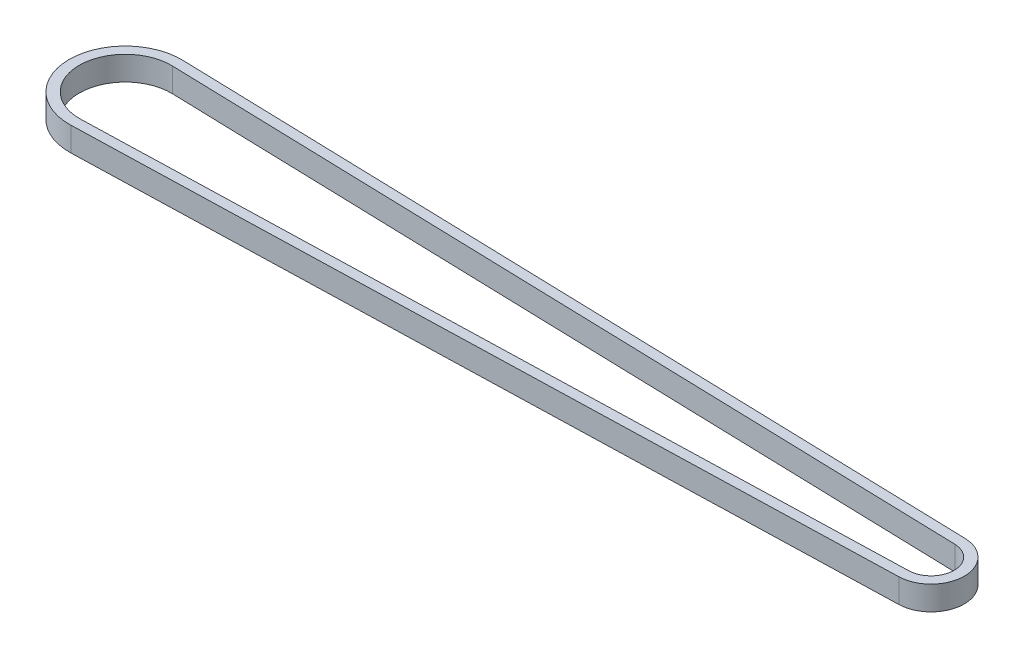
ISO-10303-21;
HEADER;
FILE_DESCRIPTION(('STEP AP214'),'2;1');
FILE_NAME('part.step','',(''),(''),'','','');
FILE_SCHEMA(('AUTOMOTIVE_DESIGN { 1 0 10303 214 1 1 1 1 }'));
ENDSEC;
DATA;
#1=APPLICATION_CONTEXT('core data for automotive mechanical design processes');
#2=APPLICATION_PROTOCOL_DEFINITION('international standard','automotive_design',2000,#1);
#3=PRODUCT_CONTEXT('',#1,'mechanical');
#4=PRODUCT('Part','Part','',(#3));
#5=PRODUCT_RELATED_PRODUCT_CATEGORY('part','',(#4));
#6=PRODUCT_DEFINITION_FORMATION('','',#4);
#7=PRODUCT_DEFINITION_CONTEXT('part definition',#1,'design');
#8=PRODUCT_DEFINITION('design','',#6,#7);
#9=PRODUCT_DEFINITION_SHAPE('','',#8);
#10=(LENGTH_UNIT() NAMED_UNIT(*) SI_UNIT(.MILLI.,.METRE.));
#11=(NAMED_UNIT(*) PLANE_ANGLE_UNIT() SI_UNIT($,.RADIAN.));
#12=(NAMED_UNIT(*) SI_UNIT($,.STERADIAN.) SOLID_ANGLE_UNIT());
#13=UNCERTAINTY_MEASURE_WITH_UNIT(LENGTH_MEASURE(1.E-05),#10,'distance_accuracy_value','');
#14=(GEOMETRIC_REPRESENTATION_CONTEXT(3) GLOBAL_UNCERTAINTY_ASSIGNED_CONTEXT((#13)) GLOBAL_UNIT_ASSIGNED_CONTEXT((#10,
#11,#12)) REPRESENTATION_CONTEXT('',''));
#15=CARTESIAN_POINT('',(0.,0.,0.));
#16=DIRECTION('',(0.,0.,1.));
#17=DIRECTION('',(1.,0.,0.));
#18=AXIS2_PLACEMENT_3D('',#15,#16,#17);
#19=CARTESIAN_POINT('',(-100.33,5.9944,0.));
#20=DIRECTION('',(0.,1.,0.));
#21=DIRECTION('',(0.,0.,1.));
#22=AXIS2_PLACEMENT_3D('',#19,#20,#21);
#23=PLANE('',#22);
#24=CARTESIAN_POINT('',(-100.33,5.9944,0.));
#25=DIRECTION('',(0.,1.,0.));
#26=DIRECTION('',(0.,0.,1.));
#27=AXIS2_PLACEMENT_3D('',#24,#25,#26);
#28=CIRCLE('',#27,13.97);
#29=CARTESIAN_POINT('',(-99.9321202531646,5.9944,-13.9643328414593));
#30=VERTEX_POINT('',#29);
#31=CARTESIAN_POINT('',(-99.9321202531646,5.9944,13.9643328414593));
#32=VERTEX_POINT('',#31);
#33=EDGE_CURVE('E159',#30,#32,#28,.T.);
#34=ORIENTED_EDGE('',*,*,#33,.T.);
#35=DIRECTION('',(0.999594333676398,0.,-0.0284810126582278));
#36=VECTOR('',#35,1.);
#37=CARTESIAN_POINT('',(-99.9321202531646,5.9944,13.9643328414593));
#38=LINE('',#37,#36);
#39=CARTESIAN_POINT('',(100.565110759494,5.9944,8.25165122449866));
#40=VERTEX_POINT('',#39);
#41=EDGE_CURVE('E163',#32,#40,#38,.T.);
#42=ORIENTED_EDGE('',*,*,#41,.T.);
#43=CARTESIAN_POINT('',(100.33,5.9944,0.));
#44=DIRECTION('',(0.,1.,0.));
#45=DIRECTION('',(0.,0.,1.));
#46=AXIS2_PLACEMENT_3D('',#43,#44,#45);
#47=CIRCLE('',#46,8.255);
#48=CARTESIAN_POINT('',(100.565110759494,5.9944,-8.25165122449867));
#49=VERTEX_POINT('',#48);
#50=EDGE_CURVE('E167',#40,#49,#47,.T.);
#51=ORIENTED_EDGE('',*,*,#50,.T.);
#52=DIRECTION('',(-0.999594333676398,0.,-0.0284810126582278));
#53=VECTOR('',#52,1.);
#54=CARTESIAN_POINT('',(-99.9321202531646,5.9944,-13.9643328414593));
#55=LINE('',#54,#53);
#56=EDGE_CURVE('E170',#49,#30,#55,.T.);
#57=ORIENTED_EDGE('',*,*,#56,.T.);
#58=EDGE_LOOP('',(#34,#42,#51,#57));
#59=FACE_BOUND('',#58,.T.);
#60=DIRECTION('',(0.999592709057525,0.,-0.0285379746835443));
#61=VECTOR('',#60,1.);
#62=CARTESIAN_POINT('',(-100.00308608481,5.9944,11.4507343193376));
#63=LINE('',#62,#61);
#64=CARTESIAN_POINT('',(-100.00308608481,5.9944,11.4507343193376));
#65=VERTEX_POINT('',#64);
#66=CARTESIAN_POINT('',(100.493493200823,5.9944,5.72663664240928));
#67=VERTEX_POINT('',#66);
#68=EDGE_CURVE('E120',#65,#67,#63,.T.);
#69=ORIENTED_EDGE('',*,*,#68,.F.);
#70=CARTESIAN_POINT('',(-100.33,5.9944,0.));
#71=DIRECTION('',(0.,1.,0.));
#72=DIRECTION('',(0.,0.,1.));
#73=AXIS2_PLACEMENT_3D('',#70,#71,#72);
#74=CIRCLE('',#73,11.4554);
#75=CARTESIAN_POINT('',(-100.00308608481,5.9944,-11.4507343193376));
#76=VERTEX_POINT('',#75);
#77=EDGE_CURVE('E111',#76,#65,#74,.T.);
#78=ORIENTED_EDGE('',*,*,#77,.F.);
#79=DIRECTION('',(-0.999592709057525,0.,-0.0285379746835443));
#80=VECTOR('',#79,1.);
#81=CARTESIAN_POINT('',(-100.00308608481,5.9944,-11.4507343193376));
#82=LINE('',#81,#80);
#83=CARTESIAN_POINT('',(100.493493200823,5.9944,-5.72663664240929));
#84=VERTEX_POINT('',#83);
#85=EDGE_CURVE('E137',#84,#76,#82,.T.);
#86=ORIENTED_EDGE('',*,*,#85,.F.);
#87=CARTESIAN_POINT('',(100.33,5.9944,0.));
#88=DIRECTION('',(0.,1.,0.));
#89=DIRECTION('',(0.,0.,1.));
#90=AXIS2_PLACEMENT_3D('',#87,#88,#89);
#91=CIRCLE('',#90,5.72897);
#92=EDGE_CURVE('E133',#67,#84,#91,.T.);
#93=ORIENTED_EDGE('',*,*,#92,.F.);
#94=EDGE_LOOP('',(#69,#78,#86,#93));
#95=FACE_BOUND('',#94,.T.);
#96=ADVANCED_FACE('F45',(#59,#95),#23,.T.);
#97=CARTESIAN_POINT('',(-100.33,0.,0.));
#98=DIRECTION('',(0.,1.,0.));
#99=DIRECTION('',(0.,0.,1.));
#100=AXIS2_PLACEMENT_3D('',#97,#98,#99);
#101=PLANE('',#100);
#102=CARTESIAN_POINT('',(-100.33,0.,0.));
#103=DIRECTION('',(0.,1.,0.));
#104=DIRECTION('',(0.,0.,1.));
#105=AXIS2_PLACEMENT_3D('',#102,#103,#104);
#106=CIRCLE('',#105,13.97);
#107=CARTESIAN_POINT('',(-99.9321202531646,0.,-13.9643328414593));
#108=VERTEX_POINT('',#107);
#109=CARTESIAN_POINT('',(-99.9321202531646,0.,13.9643328414593));
#110=VERTEX_POINT('',#109);
#111=EDGE_CURVE('E129',#108,#110,#106,.T.);
#112=ORIENTED_EDGE('',*,*,#111,.F.);
#113=DIRECTION('',(-0.999594333676398,0.,-0.0284810126582278));
#114=VECTOR('',#113,1.);
#115=CARTESIAN_POINT('',(-99.9321202531646,0.,-13.9643328414593));
#116=LINE('',#115,#114);
#117=CARTESIAN_POINT('',(100.565110759494,0.,-8.25165122449867));
#118=VERTEX_POINT('',#117);
#119=EDGE_CURVE('E164',#118,#108,#116,.T.);
#120=ORIENTED_EDGE('',*,*,#119,.F.);
#121=CARTESIAN_POINT('',(100.33,0.,0.));
#122=DIRECTION('',(0.,1.,0.));
#123=DIRECTION('',(0.,0.,1.));
#124=AXIS2_PLACEMENT_3D('',#121,#122,#123);
#125=CIRCLE('',#124,8.255);
#126=CARTESIAN_POINT('',(100.565110759494,0.,8.25165122449866));
#127=VERTEX_POINT('',#126);
#128=EDGE_CURVE('E180',#127,#118,#125,.T.);
#129=ORIENTED_EDGE('',*,*,#128,.F.);
#130=DIRECTION('',(0.999594333676398,0.,-0.0284810126582278));
#131=VECTOR('',#130,1.);
#132=CARTESIAN_POINT('',(-99.9321202531646,0.,13.9643328414593));
#133=LINE('',#132,#131);
#134=EDGE_CURVE('E177',#110,#127,#133,.T.);
#135=ORIENTED_EDGE('',*,*,#134,.F.);
#136=EDGE_LOOP('',(#112,#120,#129,#135));
#137=FACE_BOUND('',#136,.T.);
#138=CARTESIAN_POINT('',(-100.33,0.,0.));
#139=DIRECTION('',(0.,1.,0.));
#140=DIRECTION('',(0.,0.,1.));
#141=AXIS2_PLACEMENT_3D('',#138,#139,#140);
#142=CIRCLE('',#141,11.4554);
#143=CARTESIAN_POINT('',(-100.00308608481,0.,-11.4507343193376));
#144=VERTEX_POINT('',#143);
#145=CARTESIAN_POINT('',(-100.00308608481,0.,11.4507343193376));
#146=VERTEX_POINT('',#145);
#147=EDGE_CURVE('E69',#144,#146,#142,.T.);
#148=ORIENTED_EDGE('',*,*,#147,.T.);
#149=DIRECTION('',(0.999592709057525,0.,-0.0285379746835443));
#150=VECTOR('',#149,1.);
#151=CARTESIAN_POINT('',(-100.00308608481,0.,11.4507343193376));
#152=LINE('',#151,#150);
#153=CARTESIAN_POINT('',(100.493493200823,0.,5.72663664240928));
#154=VERTEX_POINT('',#153);
#155=EDGE_CURVE('E127',#146,#154,#152,.T.);
#156=ORIENTED_EDGE('',*,*,#155,.T.);
#157=CARTESIAN_POINT('',(100.33,0.,0.));
#158=DIRECTION('',(0.,1.,0.));
#159=DIRECTION('',(0.,0.,1.));
#160=AXIS2_PLACEMENT_3D('',#157,#158,#159);
#161=CIRCLE('',#160,5.72897);
#162=CARTESIAN_POINT('',(100.493493200823,0.,-5.72663664240928));
#163=VERTEX_POINT('',#162);
#164=EDGE_CURVE('E146',#154,#163,#161,.T.);
#165=ORIENTED_EDGE('',*,*,#164,.T.);
#166=DIRECTION('',(-0.999592709057525,0.,-0.0285379746835443));
#167=VECTOR('',#166,1.);
#168=CARTESIAN_POINT('',(-100.00308608481,0.,-11.4507343193376));
#169=LINE('',#168,#167);
#170=EDGE_CURVE('E121',#163,#144,#169,.T.);
#171=ORIENTED_EDGE('',*,*,#170,.T.);
#172=EDGE_LOOP('',(#148,#156,#165,#171));
#173=FACE_BOUND('',#172,.T.);
#174=ADVANCED_FACE('F203',(#137,#173),#101,.F.);
#175=CARTESIAN_POINT('',(-100.33,5.9944,0.));
#176=DIRECTION('',(0.,-1.,0.));
#177=DIRECTION('',(0.,0.,-1.));
#178=AXIS2_PLACEMENT_3D('',#175,#176,#177);
#179=CYLINDRICAL_SURFACE('',#178,13.97);
#180=ORIENTED_EDGE('',*,*,#111,.T.);
#181=DIRECTION('',(0.,-1.,0.));
#182=VECTOR('',#181,1.);
#183=CARTESIAN_POINT('',(-99.9321202531646,5.9944,13.9643328414593));
#184=LINE('',#183,#182);
#185=EDGE_CURVE('E11',#32,#110,#184,.T.);
#186=ORIENTED_EDGE('',*,*,#185,.F.);
#187=ORIENTED_EDGE('',*,*,#33,.F.);
#188=DIRECTION('',(0.,-1.,0.));
#189=VECTOR('',#188,1.);
#190=CARTESIAN_POINT('',(-99.9321202531646,5.9944,-13.9643328414593));
#191=LINE('',#190,#189);
#192=EDGE_CURVE('E173',#30,#108,#191,.T.);
#193=ORIENTED_EDGE('',*,*,#192,.T.);
#194=EDGE_LOOP('',(#180,#186,#187,#193));
#195=FACE_BOUND('',#194,.T.);
#196=ADVANCED_FACE('F47',(#195),#179,.T.);
#197=CARTESIAN_POINT('',(-99.9321202531646,5.9944,13.9643328414593));
#198=DIRECTION('',(-0.0284810126582278,0.,-0.999594333676398));
#199=DIRECTION('',(-0.999594333676398,0.,0.0284810126582278));
#200=AXIS2_PLACEMENT_3D('',#197,#198,#199);
#201=PLANE('',#200);
#202=ORIENTED_EDGE('',*,*,#134,.T.);
#203=DIRECTION('',(0.,-1.,0.));
#204=VECTOR('',#203,1.);
#205=CARTESIAN_POINT('',(100.565110759494,5.9944,8.25165122449866));
#206=LINE('',#205,#204);
#207=EDGE_CURVE('E54',#40,#127,#206,.T.);
#208=ORIENTED_EDGE('',*,*,#207,.F.);
#209=ORIENTED_EDGE('',*,*,#41,.F.);
#210=ORIENTED_EDGE('',*,*,#185,.T.);
#211=EDGE_LOOP('',(#202,#208,#209,#210));
#212=FACE_BOUND('',#211,.T.);
#213=ADVANCED_FACE('F213',(#212),#201,.F.);
#214=CARTESIAN_POINT('',(100.33,5.9944,0.));
#215=DIRECTION('',(0.,-1.,0.));
#216=DIRECTION('',(0.,0.,-1.));
#217=AXIS2_PLACEMENT_3D('',#214,#215,#216);
#218=CYLINDRICAL_SURFACE('',#217,8.255);
#219=ORIENTED_EDGE('',*,*,#128,.T.);
#220=DIRECTION('',(0.,-1.,0.));
#221=VECTOR('',#220,1.);
#222=CARTESIAN_POINT('',(100.565110759494,5.9944,-8.25165122449867));
#223=LINE('',#222,#221);
#224=EDGE_CURVE('E188',#49,#118,#223,.T.);
#225=ORIENTED_EDGE('',*,*,#224,.F.);
#226=ORIENTED_EDGE('',*,*,#50,.F.);
#227=ORIENTED_EDGE('',*,*,#207,.T.);
#228=EDGE_LOOP('',(#219,#225,#226,#227));
#229=FACE_BOUND('',#228,.T.);
#230=ADVANCED_FACE('F197',(#229),#218,.T.);
#231=CARTESIAN_POINT('',(-99.9321202531646,5.9944,-13.9643328414593));
#232=DIRECTION('',(-0.0284810126582278,0.,0.999594333676398));
#233=DIRECTION('',(0.999594333676398,0.,0.0284810126582278));
#234=AXIS2_PLACEMENT_3D('',#231,#232,#233);
#235=PLANE('',#234);
#236=ORIENTED_EDGE('',*,*,#119,.T.);
#237=ORIENTED_EDGE('',*,*,#192,.F.);
#238=ORIENTED_EDGE('',*,*,#56,.F.);
#239=ORIENTED_EDGE('',*,*,#224,.T.);
#240=EDGE_LOOP('',(#236,#237,#238,#239));
#241=FACE_BOUND('',#240,.T.);
#242=ADVANCED_FACE('F207',(#241),#235,.F.);
#243=CARTESIAN_POINT('',(-100.33,5.9944,0.));
#244=DIRECTION('',(0.,-1.,0.));
#245=DIRECTION('',(0.,0.,-1.));
#246=AXIS2_PLACEMENT_3D('',#243,#244,#245);
#247=CYLINDRICAL_SURFACE('',#246,11.4554);
#248=ORIENTED_EDGE('',*,*,#147,.F.);
#249=DIRECTION('',(0.,-1.,0.));
#250=VECTOR('',#249,1.);
#251=CARTESIAN_POINT('',(-100.00308608481,5.9944,-11.4507343193376));
#252=LINE('',#251,#250);
#253=EDGE_CURVE('E115',#76,#144,#252,.T.);
#254=ORIENTED_EDGE('',*,*,#253,.F.);
#255=ORIENTED_EDGE('',*,*,#77,.T.);
#256=DIRECTION('',(0.,-1.,0.));
#257=VECTOR('',#256,1.);
#258=CARTESIAN_POINT('',(-100.00308608481,5.9944,11.4507343193376));
#259=LINE('',#258,#257);
#260=EDGE_CURVE('E114',#65,#146,#259,.T.);
#261=ORIENTED_EDGE('',*,*,#260,.T.);
#262=EDGE_LOOP('',(#248,#254,#255,#261));
#263=FACE_BOUND('',#262,.T.);
#264=ADVANCED_FACE('F113',(#263),#247,.F.);
#265=CARTESIAN_POINT('',(-100.00308608481,5.9944,11.4507343193376));
#266=DIRECTION('',(-0.0285379746835443,0.,-0.999592709057525));
#267=DIRECTION('',(-0.999592709057525,0.,0.0285379746835443));
#268=AXIS2_PLACEMENT_3D('',#265,#266,#267);
#269=PLANE('',#268);
#270=ORIENTED_EDGE('',*,*,#155,.F.);
#271=ORIENTED_EDGE('',*,*,#260,.F.);
#272=ORIENTED_EDGE('',*,*,#68,.T.);
#273=DIRECTION('',(0.,-1.,0.));
#274=VECTOR('',#273,1.);
#275=CARTESIAN_POINT('',(100.493493200823,5.9944,5.72663664240928));
#276=LINE('',#275,#274);
#277=EDGE_CURVE('E130',#67,#154,#276,.T.);
#278=ORIENTED_EDGE('',*,*,#277,.T.);
#279=EDGE_LOOP('',(#270,#271,#272,#278));
#280=FACE_BOUND('',#279,.T.);
#281=ADVANCED_FACE('F124',(#280),#269,.T.);
#282=CARTESIAN_POINT('',(100.33,5.9944,0.));
#283=DIRECTION('',(0.,-1.,0.));
#284=DIRECTION('',(0.,0.,-1.));
#285=AXIS2_PLACEMENT_3D('',#282,#283,#284);
#286=CYLINDRICAL_SURFACE('',#285,5.72897);
#287=ORIENTED_EDGE('',*,*,#164,.F.);
#288=ORIENTED_EDGE('',*,*,#277,.F.);
#289=ORIENTED_EDGE('',*,*,#92,.T.);
#290=DIRECTION('',(0.,-1.,0.));
#291=VECTOR('',#290,1.);
#292=CARTESIAN_POINT('',(100.493493200823,5.9944,-5.72663664240928));
#293=LINE('',#292,#291);
#294=EDGE_CURVE('E61',#84,#163,#293,.T.);
#295=ORIENTED_EDGE('',*,*,#294,.T.);
#296=EDGE_LOOP('',(#287,#288,#289,#295));
#297=FACE_BOUND('',#296,.T.);
#298=ADVANCED_FACE('F236',(#297),#286,.F.);
#299=CARTESIAN_POINT('',(-100.00308608481,5.9944,-11.4507343193376));
#300=DIRECTION('',(-0.0285379746835443,0.,0.999592709057525));
#301=DIRECTION('',(0.999592709057525,0.,0.0285379746835443));
#302=AXIS2_PLACEMENT_3D('',#299,#300,#301);
#303=PLANE('',#302);
#304=ORIENTED_EDGE('',*,*,#170,.F.);
#305=ORIENTED_EDGE('',*,*,#294,.F.);
#306=ORIENTED_EDGE('',*,*,#85,.T.);
#307=ORIENTED_EDGE('',*,*,#253,.T.);
#308=EDGE_LOOP('',(#304,#305,#306,#307));
#309=FACE_BOUND('',#308,.T.);
#310=ADVANCED_FACE('F240',(#309),#303,.T.);
#311=CLOSED_SHELL('',(#96,#174,#196,#213,#230,#242,#264,#281,#298,#310));
#312=MANIFOLD_SOLID_BREP('B2',#311);
#313=ADVANCED_BREP_SHAPE_REPRESENTATION('',(#18,#312),#14);
#314=SHAPE_DEFINITION_REPRESENTATION(#9,#313);
ENDSEC;
END-ISO-10303-21;
